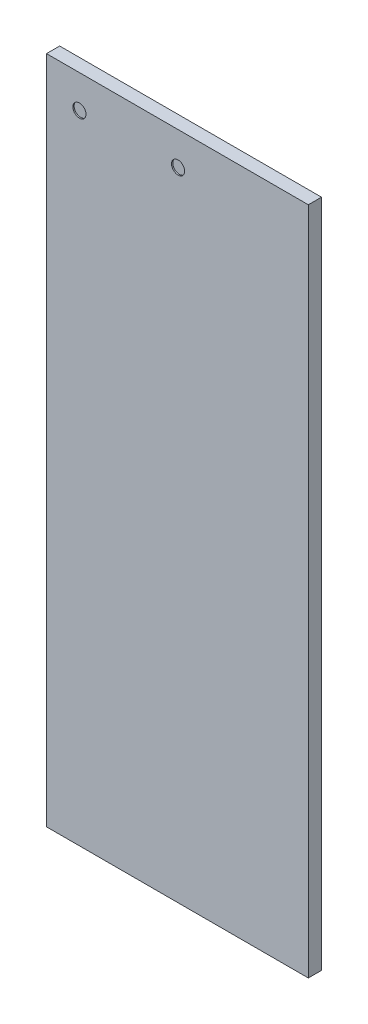
ISO-10303-21;
HEADER;
FILE_DESCRIPTION(('STEP AP214'),'2;1');
FILE_NAME('part.step','',(''),(''),'','','');
FILE_SCHEMA(('AUTOMOTIVE_DESIGN { 1 0 10303 214 1 1 1 1 }'));
ENDSEC;
DATA;
#1=APPLICATION_CONTEXT('core data for automotive mechanical design processes');
#2=APPLICATION_PROTOCOL_DEFINITION('international standard','automotive_design',2000,#1);
#3=PRODUCT_CONTEXT('',#1,'mechanical');
#4=PRODUCT('Part','Part','',(#3));
#5=PRODUCT_RELATED_PRODUCT_CATEGORY('part','',(#4));
#6=PRODUCT_DEFINITION_FORMATION('','',#4);
#7=PRODUCT_DEFINITION_CONTEXT('part definition',#1,'design');
#8=PRODUCT_DEFINITION('design','',#6,#7);
#9=PRODUCT_DEFINITION_SHAPE('','',#8);
#10=(LENGTH_UNIT() NAMED_UNIT(*) SI_UNIT(.MILLI.,.METRE.));
#11=(NAMED_UNIT(*) PLANE_ANGLE_UNIT() SI_UNIT($,.RADIAN.));
#12=(NAMED_UNIT(*) SI_UNIT($,.STERADIAN.) SOLID_ANGLE_UNIT());
#13=UNCERTAINTY_MEASURE_WITH_UNIT(LENGTH_MEASURE(1.E-05),#10,'distance_accuracy_value','');
#14=(GEOMETRIC_REPRESENTATION_CONTEXT(3) GLOBAL_UNCERTAINTY_ASSIGNED_CONTEXT((#13)) GLOBAL_UNIT_ASSIGNED_CONTEXT((#10,
#11,#12)) REPRESENTATION_CONTEXT('',''));
#15=CARTESIAN_POINT('',(0.,0.,0.));
#16=DIRECTION('',(0.,0.,1.));
#17=DIRECTION('',(1.,0.,0.));
#18=AXIS2_PLACEMENT_3D('',#15,#16,#17);
#19=CARTESIAN_POINT('',(199.,-509.,20.));
#20=DIRECTION('',(0.,-1.,0.));
#21=DIRECTION('',(0.,0.,-1.));
#22=AXIS2_PLACEMENT_3D('',#19,#20,#21);
#23=PLANE('',#22);
#24=DIRECTION('',(-1.,0.,0.));
#25=VECTOR('',#24,1.);
#26=CARTESIAN_POINT('',(199.,-509.,0.));
#27=LINE('',#26,#25);
#28=CARTESIAN_POINT('',(199.,-509.,0.));
#29=VERTEX_POINT('',#28);
#30=CARTESIAN_POINT('',(-199.,-509.,0.));
#31=VERTEX_POINT('',#30);
#32=EDGE_CURVE('E99',#29,#31,#27,.T.);
#33=ORIENTED_EDGE('',*,*,#32,.F.);
#34=DIRECTION('',(0.,0.,-1.));
#35=VECTOR('',#34,1.);
#36=CARTESIAN_POINT('',(199.,-509.,20.));
#37=LINE('',#36,#35);
#38=CARTESIAN_POINT('',(199.,-509.,20.));
#39=VERTEX_POINT('',#38);
#40=EDGE_CURVE('E11',#39,#29,#37,.T.);
#41=ORIENTED_EDGE('',*,*,#40,.F.);
#42=DIRECTION('',(-1.,0.,0.));
#43=VECTOR('',#42,1.);
#44=CARTESIAN_POINT('',(199.,-509.,20.));
#45=LINE('',#44,#43);
#46=CARTESIAN_POINT('',(-199.,-509.,20.));
#47=VERTEX_POINT('',#46);
#48=EDGE_CURVE('E93',#39,#47,#45,.T.);
#49=ORIENTED_EDGE('',*,*,#48,.T.);
#50=DIRECTION('',(0.,0.,-1.));
#51=VECTOR('',#50,1.);
#52=CARTESIAN_POINT('',(-199.,-509.,20.));
#53=LINE('',#52,#51);
#54=EDGE_CURVE('E36',#47,#31,#53,.T.);
#55=ORIENTED_EDGE('',*,*,#54,.T.);
#56=EDGE_LOOP('',(#33,#41,#49,#55));
#57=FACE_BOUND('',#56,.T.);
#58=ADVANCED_FACE('F33',(#57),#23,.T.);
#59=CARTESIAN_POINT('',(199.,-509.,20.));
#60=DIRECTION('',(-1.,0.,0.));
#61=DIRECTION('',(0.,0.,1.));
#62=AXIS2_PLACEMENT_3D('',#59,#60,#61);
#63=PLANE('',#62);
#64=DIRECTION('',(0.,1.,0.));
#65=VECTOR('',#64,1.);
#66=CARTESIAN_POINT('',(199.,-509.,0.));
#67=LINE('',#66,#65);
#68=CARTESIAN_POINT('',(199.,509.,0.));
#69=VERTEX_POINT('',#68);
#70=EDGE_CURVE('E66',#29,#69,#67,.T.);
#71=ORIENTED_EDGE('',*,*,#70,.T.);
#72=DIRECTION('',(0.,0.,-1.));
#73=VECTOR('',#72,1.);
#74=CARTESIAN_POINT('',(199.,509.,20.));
#75=LINE('',#74,#73);
#76=CARTESIAN_POINT('',(199.,509.,20.));
#77=VERTEX_POINT('',#76);
#78=EDGE_CURVE('E42',#77,#69,#75,.T.);
#79=ORIENTED_EDGE('',*,*,#78,.F.);
#80=DIRECTION('',(0.,1.,0.));
#81=VECTOR('',#80,1.);
#82=CARTESIAN_POINT('',(199.,-509.,20.));
#83=LINE('',#82,#81);
#84=EDGE_CURVE('E83',#39,#77,#83,.T.);
#85=ORIENTED_EDGE('',*,*,#84,.F.);
#86=ORIENTED_EDGE('',*,*,#40,.T.);
#87=EDGE_LOOP('',(#71,#79,#85,#86));
#88=FACE_BOUND('',#87,.T.);
#89=ADVANCED_FACE('F110',(#88),#63,.F.);
#90=CARTESIAN_POINT('',(199.,509.,20.));
#91=DIRECTION('',(0.,-1.,0.));
#92=DIRECTION('',(1.,0.,0.));
#93=AXIS2_PLACEMENT_3D('',#90,#91,#92);
#94=PLANE('',#93);
#95=DIRECTION('',(-1.,0.,0.));
#96=VECTOR('',#95,1.);
#97=CARTESIAN_POINT('',(199.,509.,0.));
#98=LINE('',#97,#96);
#99=CARTESIAN_POINT('',(-199.,509.,0.));
#100=VERTEX_POINT('',#99);
#101=EDGE_CURVE('E90',#69,#100,#98,.T.);
#102=ORIENTED_EDGE('',*,*,#101,.T.);
#103=DIRECTION('',(0.,0.,-1.));
#104=VECTOR('',#103,1.);
#105=CARTESIAN_POINT('',(-199.,509.,20.));
#106=LINE('',#105,#104);
#107=CARTESIAN_POINT('',(-199.,509.,20.));
#108=VERTEX_POINT('',#107);
#109=EDGE_CURVE('E87',#108,#100,#106,.T.);
#110=ORIENTED_EDGE('',*,*,#109,.F.);
#111=DIRECTION('',(-1.,0.,0.));
#112=VECTOR('',#111,1.);
#113=CARTESIAN_POINT('',(199.,509.,20.));
#114=LINE('',#113,#112);
#115=EDGE_CURVE('E78',#77,#108,#114,.T.);
#116=ORIENTED_EDGE('',*,*,#115,.F.);
#117=ORIENTED_EDGE('',*,*,#78,.T.);
#118=EDGE_LOOP('',(#102,#110,#116,#117));
#119=FACE_BOUND('',#118,.T.);
#120=ADVANCED_FACE('F88',(#119),#94,.F.);
#121=CARTESIAN_POINT('',(-199.,-509.,20.));
#122=DIRECTION('',(-1.,0.,0.));
#123=DIRECTION('',(0.,0.,1.));
#124=AXIS2_PLACEMENT_3D('',#121,#122,#123);
#125=PLANE('',#124);
#126=DIRECTION('',(0.,1.,0.));
#127=VECTOR('',#126,1.);
#128=CARTESIAN_POINT('',(-199.,-509.,0.));
#129=LINE('',#128,#127);
#130=EDGE_CURVE('E102',#31,#100,#129,.T.);
#131=ORIENTED_EDGE('',*,*,#130,.F.);
#132=ORIENTED_EDGE('',*,*,#54,.F.);
#133=DIRECTION('',(0.,1.,0.));
#134=VECTOR('',#133,1.);
#135=CARTESIAN_POINT('',(-199.,-509.,20.));
#136=LINE('',#135,#134);
#137=EDGE_CURVE('E82',#47,#108,#136,.T.);
#138=ORIENTED_EDGE('',*,*,#137,.T.);
#139=ORIENTED_EDGE('',*,*,#109,.T.);
#140=EDGE_LOOP('',(#131,#132,#138,#139));
#141=FACE_BOUND('',#140,.T.);
#142=ADVANCED_FACE('F92',(#141),#125,.T.);
#143=CARTESIAN_POINT('',(0.,0.,20.));
#144=DIRECTION('',(0.,0.,-1.));
#145=DIRECTION('',(-1.,0.,0.));
#146=AXIS2_PLACEMENT_3D('',#143,#144,#145);
#147=PLANE('',#146);
#148=CARTESIAN_POINT('',(-149.,459.,20.));
#149=DIRECTION('',(0.,0.,1.));
#150=DIRECTION('',(1.,0.,0.));
#151=AXIS2_PLACEMENT_3D('',#148,#149,#150);
#152=CIRCLE('',#151,10.);
#153=CARTESIAN_POINT('',(-139.,459.,20.));
#154=VERTEX_POINT('',#153);
#155=EDGE_CURVE('E151',#154,#154,#152,.T.);
#156=ORIENTED_EDGE('',*,*,#155,.F.);
#157=EDGE_LOOP('',(#156));
#158=FACE_BOUND('',#157,.T.);
#159=CARTESIAN_POINT('',(0.999999999999973,459.,20.));
#160=DIRECTION('',(0.,0.,1.));
#161=DIRECTION('',(1.,0.,0.));
#162=AXIS2_PLACEMENT_3D('',#159,#160,#161);
#163=CIRCLE('',#162,10.);
#164=CARTESIAN_POINT('',(11.,459.,20.));
#165=VERTEX_POINT('',#164);
#166=EDGE_CURVE('E158',#165,#165,#163,.T.);
#167=ORIENTED_EDGE('',*,*,#166,.F.);
#168=EDGE_LOOP('',(#167));
#169=FACE_BOUND('',#168,.T.);
#170=ORIENTED_EDGE('',*,*,#48,.F.);
#171=ORIENTED_EDGE('',*,*,#84,.T.);
#172=ORIENTED_EDGE('',*,*,#115,.T.);
#173=ORIENTED_EDGE('',*,*,#137,.F.);
#174=EDGE_LOOP('',(#170,#171,#172,#173));
#175=FACE_BOUND('',#174,.T.);
#176=ADVANCED_FACE('F81',(#158,#169,#175),#147,.F.);
#177=CARTESIAN_POINT('',(0.,0.,0.));
#178=DIRECTION('',(0.,0.,-1.));
#179=DIRECTION('',(-1.,0.,0.));
#180=AXIS2_PLACEMENT_3D('',#177,#178,#179);
#181=PLANE('',#180);
#182=ORIENTED_EDGE('',*,*,#32,.T.);
#183=ORIENTED_EDGE('',*,*,#130,.T.);
#184=ORIENTED_EDGE('',*,*,#101,.F.);
#185=ORIENTED_EDGE('',*,*,#70,.F.);
#186=EDGE_LOOP('',(#182,#183,#184,#185));
#187=FACE_BOUND('',#186,.T.);
#188=ADVANCED_FACE('F108',(#187),#181,.T.);
#189=CARTESIAN_POINT('',(0.999999999999973,459.,18.));
#190=DIRECTION('',(0.,0.,1.));
#191=DIRECTION('',(1.,0.,0.));
#192=AXIS2_PLACEMENT_3D('',#189,#190,#191);
#193=CYLINDRICAL_SURFACE('',#192,10.);
#194=CARTESIAN_POINT('',(0.999999999999973,459.,18.));
#195=DIRECTION('',(0.,0.,1.));
#196=DIRECTION('',(1.,0.,0.));
#197=AXIS2_PLACEMENT_3D('',#194,#195,#196);
#198=CIRCLE('',#197,10.);
#199=CARTESIAN_POINT('',(11.,459.,18.));
#200=VERTEX_POINT('',#199);
#201=EDGE_CURVE('E154',#200,#200,#198,.T.);
#202=ORIENTED_EDGE('',*,*,#201,.F.);
#203=EDGE_LOOP('',(#202));
#204=FACE_BOUND('',#203,.T.);
#205=ORIENTED_EDGE('',*,*,#166,.T.);
#206=EDGE_LOOP('',(#205));
#207=FACE_BOUND('',#206,.T.);
#208=ADVANCED_FACE('F129',(#204,#207),#193,.F.);
#209=CARTESIAN_POINT('',(0.999999999999973,459.,18.));
#210=DIRECTION('',(0.,0.,1.));
#211=DIRECTION('',(1.,0.,0.));
#212=AXIS2_PLACEMENT_3D('',#209,#210,#211);
#213=PLANE('',#212);
#214=ORIENTED_EDGE('',*,*,#201,.T.);
#215=EDGE_LOOP('',(#214));
#216=FACE_BOUND('',#215,.T.);
#217=ADVANCED_FACE('F135',(#216),#213,.T.);
#218=CARTESIAN_POINT('',(-149.,459.,18.));
#219=DIRECTION('',(0.,0.,1.));
#220=DIRECTION('',(1.,0.,0.));
#221=AXIS2_PLACEMENT_3D('',#218,#219,#220);
#222=CYLINDRICAL_SURFACE('',#221,10.);
#223=CARTESIAN_POINT('',(-149.,459.,18.));
#224=DIRECTION('',(0.,0.,1.));
#225=DIRECTION('',(1.,0.,0.));
#226=AXIS2_PLACEMENT_3D('',#223,#224,#225);
#227=CIRCLE('',#226,10.);
#228=CARTESIAN_POINT('',(-139.,459.,18.));
#229=VERTEX_POINT('',#228);
#230=EDGE_CURVE('E103',#229,#229,#227,.T.);
#231=ORIENTED_EDGE('',*,*,#230,.F.);
#232=EDGE_LOOP('',(#231));
#233=FACE_BOUND('',#232,.T.);
#234=ORIENTED_EDGE('',*,*,#155,.T.);
#235=EDGE_LOOP('',(#234));
#236=FACE_BOUND('',#235,.T.);
#237=ADVANCED_FACE('F139',(#233,#236),#222,.F.);
#238=CARTESIAN_POINT('',(-149.,459.,18.));
#239=DIRECTION('',(0.,0.,1.));
#240=DIRECTION('',(1.,0.,0.));
#241=AXIS2_PLACEMENT_3D('',#238,#239,#240);
#242=PLANE('',#241);
#243=ORIENTED_EDGE('',*,*,#230,.T.);
#244=EDGE_LOOP('',(#243));
#245=FACE_BOUND('',#244,.T.);
#246=ADVANCED_FACE('F143',(#245),#242,.T.);
#247=CLOSED_SHELL('',(#58,#89,#120,#142,#176,#188,#208,#217,#237,#246));
#248=MANIFOLD_SOLID_BREP('B2',#247);
#249=ADVANCED_BREP_SHAPE_REPRESENTATION('',(#18,#248),#14);
#250=SHAPE_DEFINITION_REPRESENTATION(#9,#249);
ENDSEC;
END-ISO-10303-21;
